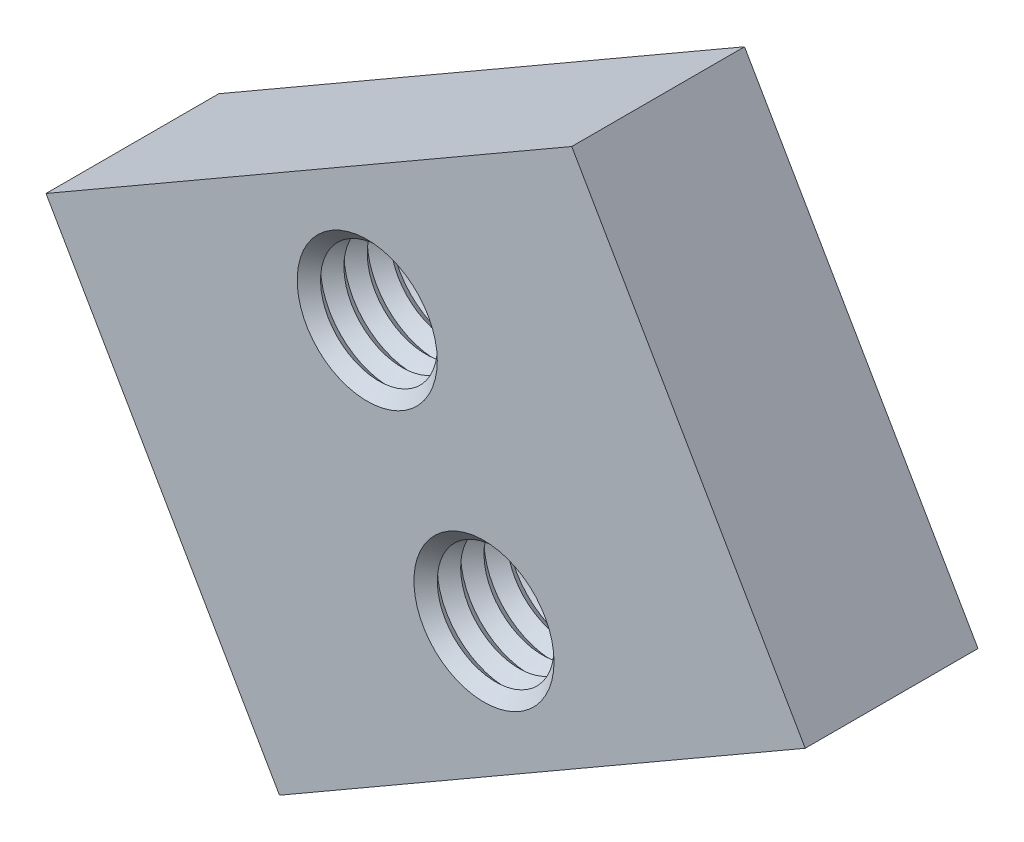
ISO-10303-21;
HEADER;
FILE_DESCRIPTION(('STEP AP214'),'2;1');
FILE_NAME('part.step','',(''),(''),'','','');
FILE_SCHEMA(('AUTOMOTIVE_DESIGN { 1 0 10303 214 1 1 1 1 }'));
ENDSEC;
DATA;
#1=APPLICATION_CONTEXT('core data for automotive mechanical design processes');
#2=APPLICATION_PROTOCOL_DEFINITION('international standard','automotive_design',2000,#1);
#3=PRODUCT_CONTEXT('',#1,'mechanical');
#4=PRODUCT('Part','Part','',(#3));
#5=PRODUCT_RELATED_PRODUCT_CATEGORY('part','',(#4));
#6=PRODUCT_DEFINITION_FORMATION('','',#4);
#7=PRODUCT_DEFINITION_CONTEXT('part definition',#1,'design');
#8=PRODUCT_DEFINITION('design','',#6,#7);
#9=PRODUCT_DEFINITION_SHAPE('','',#8);
#10=(LENGTH_UNIT() NAMED_UNIT(*) SI_UNIT(.MILLI.,.METRE.));
#11=(NAMED_UNIT(*) PLANE_ANGLE_UNIT() SI_UNIT($,.RADIAN.));
#12=(NAMED_UNIT(*) SI_UNIT($,.STERADIAN.) SOLID_ANGLE_UNIT());
#13=UNCERTAINTY_MEASURE_WITH_UNIT(LENGTH_MEASURE(1.E-05),#10,'distance_accuracy_value','');
#14=(GEOMETRIC_REPRESENTATION_CONTEXT(3) GLOBAL_UNCERTAINTY_ASSIGNED_CONTEXT((#13)) GLOBAL_UNIT_ASSIGNED_CONTEXT((#10,
#11,#12)) REPRESENTATION_CONTEXT('',''));
#15=CARTESIAN_POINT('',(0.,0.,0.));
#16=DIRECTION('',(0.,0.,1.));
#17=DIRECTION('',(1.,0.,0.));
#18=AXIS2_PLACEMENT_3D('',#15,#16,#17);
#19=CARTESIAN_POINT('',(29.,-50.2294734194975,47.1999999999753));
#20=DIRECTION('',(0.,0.,1.));
#21=DIRECTION('',(0.,-1.,0.));
#22=AXIS2_PLACEMENT_3D('',#19,#20,#21);
#23=CONICAL_SURFACE('',#22,1.500000000006,0.785398163441604);
#24=CARTESIAN_POINT('',(29.,-50.2294734194975,47.1999999999753));
#25=DIRECTION('',(0.,0.,-1.));
#26=DIRECTION('',(-0.866025403789103,-0.499999999991921,0.));
#27=AXIS2_PLACEMENT_3D('',#24,#25,#26);
#28=CIRCLE('',#27,1.500000000006);
#29=CARTESIAN_POINT('',(27.7009618943111,-50.9794734194884,47.1999999999753));
#30=VERTEX_POINT('',#29);
#31=EDGE_CURVE('E208',#30,#30,#28,.F.);
#32=ORIENTED_EDGE('',*,*,#31,.T.);
#33=EDGE_LOOP('',(#32));
#34=FACE_BOUND('',#33,.T.);
#35=CARTESIAN_POINT('',(29.,-50.2294734194975,46.9499999999812));
#36=DIRECTION('',(0.,0.,-1.));
#37=DIRECTION('',(-0.866025403784937,-0.499999999999137,0.));
#38=AXIS2_PLACEMENT_3D('',#35,#36,#37);
#39=CIRCLE('',#38,1.24999999998984);
#40=CARTESIAN_POINT('',(27.9174682452776,-50.8544734194913,46.9499999999812));
#41=VERTEX_POINT('',#40);
#42=EDGE_CURVE('E218',#41,#41,#39,.T.);
#43=ORIENTED_EDGE('',*,*,#42,.T.);
#44=EDGE_LOOP('',(#43));
#45=FACE_BOUND('',#44,.T.);
#46=ADVANCED_FACE('F17',(#34,#45),#23,.F.);
#47=CARTESIAN_POINT('',(31.5,-54.5596004384197,47.1999999999753));
#48=DIRECTION('',(0.,0.,1.));
#49=DIRECTION('',(0.,-1.,0.));
#50=AXIS2_PLACEMENT_3D('',#47,#48,#49);
#51=CONICAL_SURFACE('',#50,1.50000000001275,0.785398163441604);
#52=CARTESIAN_POINT('',(31.5,-54.5596004384197,47.1999999999753));
#53=DIRECTION('',(0.,0.,-1.));
#54=DIRECTION('',(-0.866025403786721,-0.499999999996046,0.));
#55=AXIS2_PLACEMENT_3D('',#52,#53,#54);
#56=CIRCLE('',#55,1.50000000001275);
#57=CARTESIAN_POINT('',(30.2009618943089,-55.3096004384201,47.1999999999753));
#58=VERTEX_POINT('',#57);
#59=EDGE_CURVE('E203',#58,#58,#56,.F.);
#60=ORIENTED_EDGE('',*,*,#59,.T.);
#61=EDGE_LOOP('',(#60));
#62=FACE_BOUND('',#61,.T.);
#63=CARTESIAN_POINT('',(31.5,-54.5596004384197,46.9499999999812));
#64=DIRECTION('',(0.,0.,-1.));
#65=DIRECTION('',(-0.866025403782079,-0.500000000004087,0.));
#66=AXIS2_PLACEMENT_3D('',#63,#64,#65);
#67=CIRCLE('',#66,1.24999999999658);
#68=CARTESIAN_POINT('',(30.4174682452754,-55.1846004384231,46.9499999999812));
#69=VERTEX_POINT('',#68);
#70=EDGE_CURVE('E213',#69,#69,#67,.T.);
#71=ORIENTED_EDGE('',*,*,#70,.T.);
#72=EDGE_LOOP('',(#71));
#73=FACE_BOUND('',#72,.T.);
#74=ADVANCED_FACE('F385',(#62,#73),#51,.F.);
#75=CARTESIAN_POINT('',(29.,-50.2294734194975,46.6999999999302));
#76=DIRECTION('',(0.,0.,-1.));
#77=DIRECTION('',(-1.,0.,0.));
#78=AXIS2_PLACEMENT_3D('',#75,#76,#77);
#79=CONICAL_SURFACE('',#78,1.50000000002021,0.785398163369529);
#80=CARTESIAN_POINT('',(29.,-50.2294734194975,46.7000000000439));
#81=DIRECTION('',(0.,0.,1.));
#82=DIRECTION('',(-0.866025403780898,-0.500000000006132,0.));
#83=AXIS2_PLACEMENT_3D('',#80,#81,#82);
#84=CIRCLE('',#83,1.50000000002021);
#85=CARTESIAN_POINT('',(27.7009618943111,-50.9794734195168,46.7000000000439));
#86=VERTEX_POINT('',#85);
#87=EDGE_CURVE('E198',#86,#86,#84,.F.);
#88=ORIENTED_EDGE('',*,*,#87,.T.);
#89=EDGE_LOOP('',(#88));
#90=FACE_BOUND('',#89,.T.);
#91=ORIENTED_EDGE('',*,*,#42,.F.);
#92=EDGE_LOOP('',(#91));
#93=FACE_BOUND('',#92,.T.);
#94=ADVANCED_FACE('F382',(#90,#93),#79,.F.);
#95=CARTESIAN_POINT('',(31.5,-54.5596004384197,46.7000000000439));
#96=DIRECTION('',(0.,0.,-1.));
#97=DIRECTION('',(-1.,0.,0.));
#98=AXIS2_PLACEMENT_3D('',#95,#96,#97);
#99=CONICAL_SURFACE('',#98,1.49999999994931,0.785398163441605);
#100=CARTESIAN_POINT('',(31.5,-54.5596004384197,46.7000000000439));
#101=DIRECTION('',(0.,0.,1.));
#102=DIRECTION('',(-0.866025403778517,-0.500000000010257,0.));
#103=AXIS2_PLACEMENT_3D('',#100,#101,#102);
#104=CIRCLE('',#103,1.50000000002696);
#105=CARTESIAN_POINT('',(30.2009618943089,-55.3096004384486,46.7000000000439));
#106=VERTEX_POINT('',#105);
#107=EDGE_CURVE('E193',#106,#106,#104,.F.);
#108=ORIENTED_EDGE('',*,*,#107,.T.);
#109=EDGE_LOOP('',(#108));
#110=FACE_BOUND('',#109,.T.);
#111=ORIENTED_EDGE('',*,*,#70,.F.);
#112=EDGE_LOOP('',(#111));
#113=FACE_BOUND('',#112,.T.);
#114=ADVANCED_FACE('F378',(#110,#113),#99,.F.);
#115=CARTESIAN_POINT('',(29.,-50.2294734194975,47.2000000000321));
#116=DIRECTION('',(0.,0.,-1.));
#117=DIRECTION('',(-1.,0.,0.));
#118=AXIS2_PLACEMENT_3D('',#115,#116,#117);
#119=CONICAL_SURFACE('',#118,1.49999999989334,0.785398163343147);
#120=ORIENTED_EDGE('',*,*,#31,.F.);
#121=EDGE_LOOP('',(#120));
#122=FACE_BOUND('',#121,.T.);
#123=CARTESIAN_POINT('',(29.,-50.2294734194975,47.4500000000262));
#124=DIRECTION('',(0.,0.,1.));
#125=DIRECTION('',(-0.866025403784937,-0.499999999999137,0.));
#126=AXIS2_PLACEMENT_3D('',#123,#124,#125);
#127=CIRCLE('',#126,1.24999999998984);
#128=CARTESIAN_POINT('',(27.9174682452776,-50.8544734194913,47.4500000000262));
#129=VERTEX_POINT('',#128);
#130=EDGE_CURVE('E188',#129,#129,#127,.T.);
#131=ORIENTED_EDGE('',*,*,#130,.T.);
#132=EDGE_LOOP('',(#131));
#133=FACE_BOUND('',#132,.T.);
#134=ADVANCED_FACE('F374',(#122,#133),#119,.F.);
#135=CARTESIAN_POINT('',(31.5,-54.5596004384197,47.2000000000321));
#136=DIRECTION('',(0.,0.,-1.));
#137=DIRECTION('',(-1.,0.,0.));
#138=AXIS2_PLACEMENT_3D('',#135,#136,#137);
#139=CONICAL_SURFACE('',#138,1.49999999990008,0.785398163343149);
#140=ORIENTED_EDGE('',*,*,#59,.F.);
#141=EDGE_LOOP('',(#140));
#142=FACE_BOUND('',#141,.T.);
#143=CARTESIAN_POINT('',(31.5,-54.5596004384197,47.4500000000262));
#144=DIRECTION('',(0.,0.,1.));
#145=DIRECTION('',(-0.866025403782079,-0.500000000004087,0.));
#146=AXIS2_PLACEMENT_3D('',#143,#144,#145);
#147=CIRCLE('',#146,1.24999999999658);
#148=CARTESIAN_POINT('',(30.4174682452754,-55.1846004384231,47.4500000000262));
#149=VERTEX_POINT('',#148);
#150=EDGE_CURVE('E183',#149,#149,#147,.T.);
#151=ORIENTED_EDGE('',*,*,#150,.T.);
#152=EDGE_LOOP('',(#151));
#153=FACE_BOUND('',#152,.T.);
#154=ADVANCED_FACE('F370',(#142,#153),#139,.F.);
#155=CARTESIAN_POINT('',(29.,-50.2294734194975,46.7000000000439));
#156=DIRECTION('',(0.,0.,1.));
#157=DIRECTION('',(1.,0.,0.));
#158=AXIS2_PLACEMENT_3D('',#155,#156,#157);
#159=CONICAL_SURFACE('',#158,1.50000000002021,0.785398163369529);
#160=ORIENTED_EDGE('',*,*,#87,.F.);
#161=EDGE_LOOP('',(#160));
#162=FACE_BOUND('',#161,.T.);
#163=CARTESIAN_POINT('',(29.,-50.2294734194975,46.4499999999362));
#164=DIRECTION('',(0.,0.,-1.));
#165=DIRECTION('',(-0.86602540378646,-0.499999999996499,0.));
#166=AXIS2_PLACEMENT_3D('',#163,#164,#165);
#167=CIRCLE('',#166,1.25000000005327);
#168=CARTESIAN_POINT('',(27.9174682452208,-50.8544734195198,46.4499999999362));
#169=VERTEX_POINT('',#168);
#170=EDGE_CURVE('E178',#169,#169,#167,.T.);
#171=ORIENTED_EDGE('',*,*,#170,.T.);
#172=EDGE_LOOP('',(#171));
#173=FACE_BOUND('',#172,.T.);
#174=ADVANCED_FACE('F366',(#162,#173),#159,.F.);
#175=CARTESIAN_POINT('',(31.5,-54.5596004384197,46.7000000000439));
#176=DIRECTION('',(0.,0.,1.));
#177=DIRECTION('',(1.,0.,0.));
#178=AXIS2_PLACEMENT_3D('',#175,#176,#177);
#179=CONICAL_SURFACE('',#178,1.50000000002696,0.78539816336953);
#180=ORIENTED_EDGE('',*,*,#107,.F.);
#181=EDGE_LOOP('',(#180));
#182=FACE_BOUND('',#181,.T.);
#183=CARTESIAN_POINT('',(31.5,-54.5596004384197,46.4500000000498));
#184=DIRECTION('',(0.,0.,-1.));
#185=DIRECTION('',(-0.866025403780556,-0.500000000006725,0.));
#186=AXIS2_PLACEMENT_3D('',#183,#184,#185);
#187=CIRCLE('',#186,1.24999999993315);
#188=CARTESIAN_POINT('',(30.4174682453322,-55.1846004383947,46.4500000000498));
#189=VERTEX_POINT('',#188);
#190=EDGE_CURVE('E173',#189,#189,#187,.T.);
#191=ORIENTED_EDGE('',*,*,#190,.T.);
#192=EDGE_LOOP('',(#191));
#193=FACE_BOUND('',#192,.T.);
#194=ADVANCED_FACE('F362',(#182,#193),#179,.F.);
#195=CARTESIAN_POINT('',(29.,-50.2294734194975,47.6999999999634));
#196=DIRECTION('',(0.,0.,1.));
#197=DIRECTION('',(1.,0.,0.));
#198=AXIS2_PLACEMENT_3D('',#195,#196,#197);
#199=CONICAL_SURFACE('',#198,1.49999999989334,0.785398163329957);
#200=CARTESIAN_POINT('',(29.,-50.2294734194975,47.7000000000203));
#201=DIRECTION('',(0.,0.,-1.));
#202=DIRECTION('',(-0.866025403779629,-0.50000000000833,0.));
#203=AXIS2_PLACEMENT_3D('',#200,#201,#202);
#204=CIRCLE('',#203,1.49999999995677);
#205=CARTESIAN_POINT('',(27.700961894368,-50.9794734194884,47.7000000000203));
#206=VERTEX_POINT('',#205);
#207=EDGE_CURVE('E168',#206,#206,#204,.F.);
#208=ORIENTED_EDGE('',*,*,#207,.T.);
#209=EDGE_LOOP('',(#208));
#210=FACE_BOUND('',#209,.T.);
#211=ORIENTED_EDGE('',*,*,#130,.F.);
#212=EDGE_LOOP('',(#211));
#213=FACE_BOUND('',#212,.T.);
#214=ADVANCED_FACE('F358',(#210,#213),#199,.F.);
#215=CARTESIAN_POINT('',(31.5,-54.5596004384197,47.6999999999634));
#216=DIRECTION('',(0.,0.,1.));
#217=DIRECTION('',(1.,0.,0.));
#218=AXIS2_PLACEMENT_3D('',#215,#216,#217);
#219=CONICAL_SURFACE('',#218,1.49999999990008,0.785398163329957);
#220=CARTESIAN_POINT('',(31.5,-54.5596004384197,47.7000000000203));
#221=DIRECTION('',(0.,0.,-1.));
#222=DIRECTION('',(-0.866025403777248,-0.500000000012455,0.));
#223=AXIS2_PLACEMENT_3D('',#220,#221,#222);
#224=CIRCLE('',#223,1.49999999996352);
#225=CARTESIAN_POINT('',(30.2009618943657,-55.3096004384201,47.7000000000203));
#226=VERTEX_POINT('',#225);
#227=EDGE_CURVE('E163',#226,#226,#224,.F.);
#228=ORIENTED_EDGE('',*,*,#227,.T.);
#229=EDGE_LOOP('',(#228));
#230=FACE_BOUND('',#229,.T.);
#231=ORIENTED_EDGE('',*,*,#150,.F.);
#232=EDGE_LOOP('',(#231));
#233=FACE_BOUND('',#232,.T.);
#234=ADVANCED_FACE('F354',(#230,#233),#219,.F.);
#235=CARTESIAN_POINT('',(29.,-50.2294734194975,46.2000000000558));
#236=DIRECTION('',(0.,0.,-1.));
#237=DIRECTION('',(-1.,0.,0.));
#238=AXIS2_PLACEMENT_3D('',#235,#236,#237);
#239=CONICAL_SURFACE('',#238,1.49999999994256,0.785398163415223);
#240=CARTESIAN_POINT('',(29.,-50.2294734194975,46.1999999999989));
#241=DIRECTION('',(0.,0.,1.));
#242=DIRECTION('',(-0.866025403779629,-0.50000000000833,0.));
#243=AXIS2_PLACEMENT_3D('',#240,#241,#242);
#244=CIRCLE('',#243,1.49999999995677);
#245=CARTESIAN_POINT('',(27.700961894368,-50.9794734194884,46.1999999999989));
#246=VERTEX_POINT('',#245);
#247=EDGE_CURVE('E158',#246,#246,#244,.F.);
#248=ORIENTED_EDGE('',*,*,#247,.T.);
#249=EDGE_LOOP('',(#248));
#250=FACE_BOUND('',#249,.T.);
#251=ORIENTED_EDGE('',*,*,#170,.F.);
#252=EDGE_LOOP('',(#251));
#253=FACE_BOUND('',#252,.T.);
#254=ADVANCED_FACE('F350',(#250,#253),#239,.F.);
#255=CARTESIAN_POINT('',(31.5,-54.5596004384197,46.2000000000558));
#256=DIRECTION('',(0.,0.,-1.));
#257=DIRECTION('',(-1.,0.,0.));
#258=AXIS2_PLACEMENT_3D('',#255,#256,#257);
#259=CONICAL_SURFACE('',#258,1.49999999994931,0.785398163441605);
#260=CARTESIAN_POINT('',(31.5,-54.5596004384197,46.1999999999989));
#261=DIRECTION('',(0.,0.,1.));
#262=DIRECTION('',(-0.866025403777248,-0.500000000012455,0.));
#263=AXIS2_PLACEMENT_3D('',#260,#261,#262);
#264=CIRCLE('',#263,1.49999999996352);
#265=CARTESIAN_POINT('',(30.2009618943657,-55.3096004384201,46.1999999999989));
#266=VERTEX_POINT('',#265);
#267=EDGE_CURVE('E153',#266,#266,#264,.F.);
#268=ORIENTED_EDGE('',*,*,#267,.T.);
#269=EDGE_LOOP('',(#268));
#270=FACE_BOUND('',#269,.T.);
#271=ORIENTED_EDGE('',*,*,#190,.F.);
#272=EDGE_LOOP('',(#271));
#273=FACE_BOUND('',#272,.T.);
#274=ADVANCED_FACE('F346',(#270,#273),#259,.F.);
#275=CARTESIAN_POINT('',(29.,-50.2294734194975,47.7000000000203));
#276=DIRECTION('',(0.,0.,-1.));
#277=DIRECTION('',(-1.,0.,0.));
#278=AXIS2_PLACEMENT_3D('',#275,#276,#277);
#279=CONICAL_SURFACE('',#278,1.49999999995677,0.785398163356339);
#280=ORIENTED_EDGE('',*,*,#207,.F.);
#281=EDGE_LOOP('',(#280));
#282=FACE_BOUND('',#281,.T.);
#283=CARTESIAN_POINT('',(29.,-50.2294734194975,47.9499999999575));
#284=DIRECTION('',(0.,0.,1.));
#285=DIRECTION('',(-0.866025403794783,-0.499999999982084,0.));
#286=AXIS2_PLACEMENT_3D('',#283,#284,#285);
#287=CIRCLE('',#286,1.24999999997562);
#288=CARTESIAN_POINT('',(27.9174682452776,-50.8544734194629,47.9499999999575));
#289=VERTEX_POINT('',#288);
#290=EDGE_CURVE('E148',#289,#289,#287,.T.);
#291=ORIENTED_EDGE('',*,*,#290,.T.);
#292=EDGE_LOOP('',(#291));
#293=FACE_BOUND('',#292,.T.);
#294=ADVANCED_FACE('F338',(#282,#293),#279,.F.);
#295=CARTESIAN_POINT('',(31.5,-54.5596004384197,47.7000000000203));
#296=DIRECTION('',(0.,0.,-1.));
#297=DIRECTION('',(-1.,0.,0.));
#298=AXIS2_PLACEMENT_3D('',#295,#296,#297);
#299=CONICAL_SURFACE('',#298,1.49999999996352,0.785398163356339);
#300=ORIENTED_EDGE('',*,*,#227,.F.);
#301=EDGE_LOOP('',(#300));
#302=FACE_BOUND('',#301,.T.);
#303=CARTESIAN_POINT('',(31.5,-54.5596004384197,47.9499999999575));
#304=DIRECTION('',(0.,0.,1.));
#305=DIRECTION('',(-0.866025403791925,-0.499999999987034,0.));
#306=AXIS2_PLACEMENT_3D('',#303,#304,#305);
#307=CIRCLE('',#306,1.24999999998237);
#308=CARTESIAN_POINT('',(30.4174682452754,-55.1846004383947,47.9499999999575));
#309=VERTEX_POINT('',#308);
#310=EDGE_CURVE('E143',#309,#309,#307,.T.);
#311=ORIENTED_EDGE('',*,*,#310,.T.);
#312=EDGE_LOOP('',(#311));
#313=FACE_BOUND('',#312,.T.);
#314=ADVANCED_FACE('F327',(#302,#313),#299,.F.);
#315=CARTESIAN_POINT('',(29.,-50.2294734194975,46.1999999999989));
#316=DIRECTION('',(0.,0.,1.));
#317=DIRECTION('',(1.,0.,0.));
#318=AXIS2_PLACEMENT_3D('',#315,#316,#317);
#319=CONICAL_SURFACE('',#318,1.49999999995677,0.785398163329958);
#320=ORIENTED_EDGE('',*,*,#247,.F.);
#321=EDGE_LOOP('',(#320));
#322=FACE_BOUND('',#321,.T.);
#323=CARTESIAN_POINT('',(29.,-50.2294734194975,45.949999999948));
#324=DIRECTION('',(0.,0.,-1.));
#325=DIRECTION('',(-0.866025403775092,-0.50000000001619,0.));
#326=AXIS2_PLACEMENT_3D('',#323,#324,#325);
#327=CIRCLE('',#326,1.25000000000405);
#328=CARTESIAN_POINT('',(27.9174682452776,-50.8544734195198,45.949999999948));
#329=VERTEX_POINT('',#328);
#330=EDGE_CURVE('E138',#329,#329,#327,.T.);
#331=ORIENTED_EDGE('',*,*,#330,.T.);
#332=EDGE_LOOP('',(#331));
#333=FACE_BOUND('',#332,.T.);
#334=ADVANCED_FACE('F324',(#322,#333),#319,.F.);
#335=CARTESIAN_POINT('',(31.5,-54.5596004384197,46.1999999999989));
#336=DIRECTION('',(0.,0.,1.));
#337=DIRECTION('',(1.,0.,0.));
#338=AXIS2_PLACEMENT_3D('',#335,#336,#337);
#339=CONICAL_SURFACE('',#338,1.49999999996352,0.785398163329958);
#340=ORIENTED_EDGE('',*,*,#267,.F.);
#341=EDGE_LOOP('',(#340));
#342=FACE_BOUND('',#341,.T.);
#343=CARTESIAN_POINT('',(31.5,-54.5596004384197,45.949999999948));
#344=DIRECTION('',(0.,0.,-1.));
#345=DIRECTION('',(-0.866025403772234,-0.50000000002114,0.));
#346=AXIS2_PLACEMENT_3D('',#343,#344,#345);
#347=CIRCLE('',#346,1.2500000000108);
#348=CARTESIAN_POINT('',(30.4174682452754,-55.1846004384515,45.949999999948));
#349=VERTEX_POINT('',#348);
#350=EDGE_CURVE('E133',#349,#349,#347,.T.);
#351=ORIENTED_EDGE('',*,*,#350,.T.);
#352=EDGE_LOOP('',(#351));
#353=FACE_BOUND('',#352,.T.);
#354=ADVANCED_FACE('F326',(#342,#353),#339,.F.);
#355=CARTESIAN_POINT('',(29.,-50.2294734194975,48.1999999998379));
#356=DIRECTION('',(0.,0.,1.));
#357=DIRECTION('',(0.,-1.,0.));
#358=AXIS2_PLACEMENT_3D('',#355,#356,#357);
#359=CONICAL_SURFACE('',#358,1.49999999981569,0.785398163316767);
#360=CARTESIAN_POINT('',(29.,-50.2294734194975,48.1999999999516));
#361=DIRECTION('',(0.,0.,-1.));
#362=DIRECTION('',(-0.866025403780898,-0.500000000006132,0.));
#363=AXIS2_PLACEMENT_3D('',#360,#361,#362);
#364=CIRCLE('',#363,1.50000000002021);
#365=CARTESIAN_POINT('',(27.7009618943111,-50.9794734195168,48.1999999999516));
#366=VERTEX_POINT('',#365);
#367=EDGE_CURVE('E128',#366,#366,#364,.F.);
#368=ORIENTED_EDGE('',*,*,#367,.T.);
#369=EDGE_LOOP('',(#368));
#370=FACE_BOUND('',#369,.T.);
#371=ORIENTED_EDGE('',*,*,#290,.F.);
#372=EDGE_LOOP('',(#371));
#373=FACE_BOUND('',#372,.T.);
#374=ADVANCED_FACE('F335',(#370,#373),#359,.F.);
#375=CARTESIAN_POINT('',(31.5,-54.5596004384197,48.1999999998379));
#376=DIRECTION('',(0.,0.,1.));
#377=DIRECTION('',(0.,-1.,0.));
#378=AXIS2_PLACEMENT_3D('',#375,#376,#377);
#379=CONICAL_SURFACE('',#378,1.49999999982243,0.785398163316767);
#380=CARTESIAN_POINT('',(31.5,-54.5596004384197,48.1999999999516));
#381=DIRECTION('',(0.,0.,-1.));
#382=DIRECTION('',(-0.866025403778517,-0.500000000010257,0.));
#383=AXIS2_PLACEMENT_3D('',#380,#381,#382);
#384=CIRCLE('',#383,1.50000000002696);
#385=CARTESIAN_POINT('',(30.2009618943089,-55.3096004384486,48.1999999999516));
#386=VERTEX_POINT('',#385);
#387=EDGE_CURVE('E123',#386,#386,#384,.F.);
#388=ORIENTED_EDGE('',*,*,#387,.T.);
#389=EDGE_LOOP('',(#388));
#390=FACE_BOUND('',#389,.T.);
#391=ORIENTED_EDGE('',*,*,#310,.F.);
#392=EDGE_LOOP('',(#391));
#393=FACE_BOUND('',#392,.T.);
#394=ADVANCED_FACE('F320',(#390,#393),#379,.F.);
#395=CARTESIAN_POINT('',(29.,-50.2294734194975,45.6999999999539));
#396=DIRECTION('',(0.,0.,-1.));
#397=DIRECTION('',(-1.,0.,0.));
#398=AXIS2_PLACEMENT_3D('',#395,#396,#397);
#399=CONICAL_SURFACE('',#398,1.49999999997098,0.785398163343149);
#400=CARTESIAN_POINT('',(29.,-50.2294734194975,45.7000000000107));
#401=DIRECTION('',(0.,0.,1.));
#402=DIRECTION('',(-0.866025403779629,-0.50000000000833,0.));
#403=AXIS2_PLACEMENT_3D('',#400,#401,#402);
#404=CIRCLE('',#403,1.49999999995677);
#405=CARTESIAN_POINT('',(27.700961894368,-50.9794734194884,45.7000000000107));
#406=VERTEX_POINT('',#405);
#407=EDGE_CURVE('E118',#406,#406,#404,.F.);
#408=ORIENTED_EDGE('',*,*,#407,.T.);
#409=EDGE_LOOP('',(#408));
#410=FACE_BOUND('',#409,.T.);
#411=ORIENTED_EDGE('',*,*,#330,.F.);
#412=EDGE_LOOP('',(#411));
#413=FACE_BOUND('',#412,.T.);
#414=ADVANCED_FACE('F260',(#410,#413),#399,.F.);
#415=CARTESIAN_POINT('',(31.5,-54.5596004384197,45.6999999999539));
#416=DIRECTION('',(0.,0.,-1.));
#417=DIRECTION('',(-1.,0.,0.));
#418=AXIS2_PLACEMENT_3D('',#415,#416,#417);
#419=CONICAL_SURFACE('',#418,1.49999999997773,0.785398163343147);
#420=CARTESIAN_POINT('',(31.5,-54.5596004384197,45.7000000000107));
#421=DIRECTION('',(0.,0.,1.));
#422=DIRECTION('',(-0.866025403777248,-0.500000000012455,0.));
#423=AXIS2_PLACEMENT_3D('',#420,#421,#422);
#424=CIRCLE('',#423,1.49999999996352);
#425=CARTESIAN_POINT('',(30.2009618943657,-55.3096004384201,45.7000000000107));
#426=VERTEX_POINT('',#425);
#427=EDGE_CURVE('E113',#426,#426,#424,.F.);
#428=ORIENTED_EDGE('',*,*,#427,.T.);
#429=EDGE_LOOP('',(#428));
#430=FACE_BOUND('',#429,.T.);
#431=ORIENTED_EDGE('',*,*,#350,.F.);
#432=EDGE_LOOP('',(#431));
#433=FACE_BOUND('',#432,.T.);
#434=ADVANCED_FACE('F248',(#430,#433),#419,.F.);
#435=CARTESIAN_POINT('',(29.,-50.2294734194975,48.1999999999516));
#436=DIRECTION('',(0.,0.,-1.));
#437=DIRECTION('',(-1.,0.,0.));
#438=AXIS2_PLACEMENT_3D('',#435,#436,#437);
#439=CONICAL_SURFACE('',#438,1.50000000002021,0.785398163441604);
#440=ORIENTED_EDGE('',*,*,#367,.F.);
#441=EDGE_LOOP('',(#440));
#442=FACE_BOUND('',#441,.T.);
#443=CARTESIAN_POINT('',(29.,-50.2294734194975,48.4499999999457));
#444=DIRECTION('',(0.,0.,1.));
#445=DIRECTION('',(-0.866025403794783,-0.499999999982084,0.));
#446=AXIS2_PLACEMENT_3D('',#443,#444,#445);
#447=CIRCLE('',#446,1.24999999997562);
#448=CARTESIAN_POINT('',(27.9174682452776,-50.8544734194629,48.4499999999457));
#449=VERTEX_POINT('',#448);
#450=EDGE_CURVE('E108',#449,#449,#447,.T.);
#451=ORIENTED_EDGE('',*,*,#450,.T.);
#452=EDGE_LOOP('',(#451));
#453=FACE_BOUND('',#452,.T.);
#454=ADVANCED_FACE('F245',(#442,#453),#439,.F.);
#455=CARTESIAN_POINT('',(31.5,-54.5596004384197,48.1999999999516));
#456=DIRECTION('',(0.,0.,-1.));
#457=DIRECTION('',(-1.,0.,0.));
#458=AXIS2_PLACEMENT_3D('',#455,#456,#457);
#459=CONICAL_SURFACE('',#458,1.50000000002696,0.785398163441604);
#460=ORIENTED_EDGE('',*,*,#387,.F.);
#461=EDGE_LOOP('',(#460));
#462=FACE_BOUND('',#461,.T.);
#463=CARTESIAN_POINT('',(31.5,-54.5596004384197,48.4499999999457));
#464=DIRECTION('',(0.,0.,1.));
#465=DIRECTION('',(-0.866025403791925,-0.499999999987034,0.));
#466=AXIS2_PLACEMENT_3D('',#463,#464,#465);
#467=CIRCLE('',#466,1.24999999998237);
#468=CARTESIAN_POINT('',(30.4174682452754,-55.1846004383947,48.4499999999457));
#469=VERTEX_POINT('',#468);
#470=EDGE_CURVE('E103',#469,#469,#467,.T.);
#471=ORIENTED_EDGE('',*,*,#470,.T.);
#472=EDGE_LOOP('',(#471));
#473=FACE_BOUND('',#472,.T.);
#474=ADVANCED_FACE('F247',(#462,#473),#459,.F.);
#475=CARTESIAN_POINT('',(29.,-50.2294734194975,45.7000000000107));
#476=DIRECTION('',(0.,0.,1.));
#477=DIRECTION('',(1.,0.,0.));
#478=AXIS2_PLACEMENT_3D('',#475,#476,#477);
#479=CONICAL_SURFACE('',#478,1.49999999995677,0.785398163441604);
#480=ORIENTED_EDGE('',*,*,#407,.F.);
#481=EDGE_LOOP('',(#480));
#482=FACE_BOUND('',#481,.T.);
#483=CARTESIAN_POINT('',(29.,-50.2294734194975,45.4500000000166));
#484=DIRECTION('',(0.,0.,-1.));
#485=DIRECTION('',(-0.866025403784937,-0.499999999999137,0.));
#486=AXIS2_PLACEMENT_3D('',#483,#484,#485);
#487=CIRCLE('',#486,1.24999999998984);
#488=CARTESIAN_POINT('',(27.9174682452776,-50.8544734194913,45.4500000000166));
#489=VERTEX_POINT('',#488);
#490=EDGE_CURVE('E98',#489,#489,#487,.T.);
#491=ORIENTED_EDGE('',*,*,#490,.T.);
#492=EDGE_LOOP('',(#491));
#493=FACE_BOUND('',#492,.T.);
#494=ADVANCED_FACE('F257',(#482,#493),#479,.F.);
#495=CARTESIAN_POINT('',(31.5,-54.5596004384197,45.7000000000107));
#496=DIRECTION('',(0.,0.,1.));
#497=DIRECTION('',(1.,0.,0.));
#498=AXIS2_PLACEMENT_3D('',#495,#496,#497);
#499=CONICAL_SURFACE('',#498,1.49999999996352,0.785398163441605);
#500=ORIENTED_EDGE('',*,*,#427,.F.);
#501=EDGE_LOOP('',(#500));
#502=FACE_BOUND('',#501,.T.);
#503=CARTESIAN_POINT('',(31.5,-54.5596004384197,45.4500000000166));
#504=DIRECTION('',(0.,0.,-1.));
#505=DIRECTION('',(-0.866025403782079,-0.500000000004087,0.));
#506=AXIS2_PLACEMENT_3D('',#503,#504,#505);
#507=CIRCLE('',#506,1.24999999999658);
#508=CARTESIAN_POINT('',(30.4174682452754,-55.1846004384231,45.4500000000166));
#509=VERTEX_POINT('',#508);
#510=EDGE_CURVE('E95',#509,#509,#507,.T.);
#511=ORIENTED_EDGE('',*,*,#510,.T.);
#512=EDGE_LOOP('',(#511));
#513=FACE_BOUND('',#512,.T.);
#514=ADVANCED_FACE('F241',(#502,#513),#499,.F.);
#515=CARTESIAN_POINT('',(29.,-50.2294734194975,48.6999999999966));
#516=DIRECTION('',(0.,0.,1.));
#517=DIRECTION('',(1.,0.,0.));
#518=AXIS2_PLACEMENT_3D('',#515,#516,#517);
#519=CONICAL_SURFACE('',#518,1.500000000006,0.785398163356339);
#520=CARTESIAN_POINT('',(29.,-50.2294734194975,48.6999999999966));
#521=DIRECTION('',(0.,0.,1.));
#522=DIRECTION('',(1.,0.,0.));
#523=AXIS2_PLACEMENT_3D('',#520,#521,#522);
#524=CIRCLE('',#523,1.500000000006);
#525=CARTESIAN_POINT('',(30.500000000006,-50.2294734194975,48.6999999999966));
#526=VERTEX_POINT('',#525);
#527=EDGE_CURVE('E20',#526,#526,#524,.F.);
#528=ORIENTED_EDGE('',*,*,#527,.F.);
#529=EDGE_LOOP('',(#528));
#530=FACE_BOUND('',#529,.T.);
#531=ORIENTED_EDGE('',*,*,#450,.F.);
#532=EDGE_LOOP('',(#531));
#533=FACE_BOUND('',#532,.T.);
#534=ADVANCED_FACE('F237',(#530,#533),#519,.F.);
#535=CARTESIAN_POINT('',(31.5,-54.5596004384197,48.6999999999966));
#536=DIRECTION('',(0.,0.,1.));
#537=DIRECTION('',(1.,0.,0.));
#538=AXIS2_PLACEMENT_3D('',#535,#536,#537);
#539=CONICAL_SURFACE('',#538,1.50000000001275,0.785398163356339);
#540=CARTESIAN_POINT('',(31.5,-54.5596004384197,48.6999999999966));
#541=DIRECTION('',(0.,0.,1.));
#542=DIRECTION('',(1.,0.,0.));
#543=AXIS2_PLACEMENT_3D('',#540,#541,#542);
#544=CIRCLE('',#543,1.50000000001275);
#545=CARTESIAN_POINT('',(33.0000000000127,-54.5596004384197,48.6999999999966));
#546=VERTEX_POINT('',#545);
#547=EDGE_CURVE('E92',#546,#546,#544,.F.);
#548=ORIENTED_EDGE('',*,*,#547,.F.);
#549=EDGE_LOOP('',(#548));
#550=FACE_BOUND('',#549,.T.);
#551=ORIENTED_EDGE('',*,*,#470,.F.);
#552=EDGE_LOOP('',(#551));
#553=FACE_BOUND('',#552,.T.);
#554=ADVANCED_FACE('F240',(#550,#553),#539,.F.);
#555=CARTESIAN_POINT('',(29.,-50.2294734194975,45.2000000000794));
#556=DIRECTION('',(0.,0.,-1.));
#557=DIRECTION('',(-1.,0.,0.));
#558=AXIS2_PLACEMENT_3D('',#555,#556,#557);
#559=CONICAL_SURFACE('',#558,1.49999999994256,0.785398163441604);
#560=CARTESIAN_POINT('',(29.,-50.2294734194975,45.2000000000226));
#561=DIRECTION('',(0.,0.,1.));
#562=DIRECTION('',(-0.866025403789103,-0.499999999991921,0.));
#563=AXIS2_PLACEMENT_3D('',#560,#561,#562);
#564=CIRCLE('',#563,1.500000000006);
#565=CARTESIAN_POINT('',(27.7009618943111,-50.9794734194884,45.2000000000226));
#566=VERTEX_POINT('',#565);
#567=EDGE_CURVE('E87',#566,#566,#564,.F.);
#568=ORIENTED_EDGE('',*,*,#567,.T.);
#569=EDGE_LOOP('',(#568));
#570=FACE_BOUND('',#569,.T.);
#571=ORIENTED_EDGE('',*,*,#490,.F.);
#572=EDGE_LOOP('',(#571));
#573=FACE_BOUND('',#572,.T.);
#574=ADVANCED_FACE('F297',(#570,#573),#559,.F.);
#575=CARTESIAN_POINT('',(31.5,-54.5596004384197,45.2000000000794));
#576=DIRECTION('',(0.,0.,-1.));
#577=DIRECTION('',(-1.,0.,0.));
#578=AXIS2_PLACEMENT_3D('',#575,#576,#577);
#579=CONICAL_SURFACE('',#578,1.49999999994931,0.785398163441605);
#580=CARTESIAN_POINT('',(31.5,-54.5596004384197,45.2000000000226));
#581=DIRECTION('',(0.,0.,1.));
#582=DIRECTION('',(-0.866025403786721,-0.499999999996046,0.));
#583=AXIS2_PLACEMENT_3D('',#580,#581,#582);
#584=CIRCLE('',#583,1.50000000001275);
#585=CARTESIAN_POINT('',(30.2009618943089,-55.3096004384201,45.2000000000226));
#586=VERTEX_POINT('',#585);
#587=EDGE_CURVE('E76',#586,#586,#584,.F.);
#588=ORIENTED_EDGE('',*,*,#587,.T.);
#589=EDGE_LOOP('',(#588));
#590=FACE_BOUND('',#589,.T.);
#591=ORIENTED_EDGE('',*,*,#510,.F.);
#592=EDGE_LOOP('',(#591));
#593=FACE_BOUND('',#592,.T.);
#594=ADVANCED_FACE('F294',(#590,#593),#579,.F.);
#595=CARTESIAN_POINT('',(27.120834875401,-59.9746639478808,48.7));
#596=DIRECTION('',(0.,0.,1.));
#597=DIRECTION('',(1.,0.,0.));
#598=AXIS2_PLACEMENT_3D('',#595,#596,#597);
#599=PLANE('',#598);
#600=DIRECTION('',(-0.5,0.866025403784439,0.));
#601=VECTOR('',#600,1.);
#602=CARTESIAN_POINT('',(33.3791651245987,-44.8144099100363,48.7));
#603=LINE('',#602,#601);
#604=CARTESIAN_POINT('',(33.3791651245987,-44.8144099100363,48.7));
#605=VERTEX_POINT('',#604);
#606=CARTESIAN_POINT('',(38.3791651245987,-53.4746639478808,48.7));
#607=VERTEX_POINT('',#606);
#608=EDGE_CURVE('E67',#605,#607,#603,.F.);
#609=ORIENTED_EDGE('',*,*,#608,.F.);
#610=DIRECTION('',(-0.866025403784439,-0.5,0.));
#611=VECTOR('',#610,1.);
#612=CARTESIAN_POINT('',(22.120834875401,-51.3144099100363,48.7));
#613=LINE('',#612,#611);
#614=CARTESIAN_POINT('',(22.120834875401,-51.3144099100363,48.7));
#615=VERTEX_POINT('',#614);
#616=EDGE_CURVE('E58',#615,#605,#613,.F.);
#617=ORIENTED_EDGE('',*,*,#616,.F.);
#618=DIRECTION('',(0.5,-0.866025403784439,0.));
#619=VECTOR('',#618,1.);
#620=CARTESIAN_POINT('',(27.120834875401,-59.9746639478808,48.7));
#621=LINE('',#620,#619);
#622=CARTESIAN_POINT('',(27.120834875401,-59.9746639478808,48.7));
#623=VERTEX_POINT('',#622);
#624=EDGE_CURVE('E53',#623,#615,#621,.F.);
#625=ORIENTED_EDGE('',*,*,#624,.F.);
#626=DIRECTION('',(0.866025403784439,0.5,0.));
#627=VECTOR('',#626,1.);
#628=CARTESIAN_POINT('',(38.3791651245987,-53.4746639478808,48.7));
#629=LINE('',#628,#627);
#630=EDGE_CURVE('E72',#607,#623,#629,.F.);
#631=ORIENTED_EDGE('',*,*,#630,.F.);
#632=EDGE_LOOP('',(#609,#617,#625,#631));
#633=FACE_BOUND('',#632,.T.);
#634=ORIENTED_EDGE('',*,*,#547,.T.);
#635=EDGE_LOOP('',(#634));
#636=FACE_BOUND('',#635,.T.);
#637=ORIENTED_EDGE('',*,*,#527,.T.);
#638=EDGE_LOOP('',(#637));
#639=FACE_BOUND('',#638,.T.);
#640=ADVANCED_FACE('F70',(#633,#636,#639),#599,.T.);
#641=CARTESIAN_POINT('',(29.,-50.2294734194975,45.2000000000226));
#642=DIRECTION('',(0.,0.,1.));
#643=DIRECTION('',(1.,0.,0.));
#644=AXIS2_PLACEMENT_3D('',#641,#642,#643);
#645=CONICAL_SURFACE('',#644,1.500000000006,0.785398163444902);
#646=ORIENTED_EDGE('',*,*,#567,.F.);
#647=EDGE_LOOP('',(#646));
#648=FACE_BOUND('',#647,.T.);
#649=CARTESIAN_POINT('',(29.,-50.2294734194975,45.0000000000159));
#650=DIRECTION('',(0.,0.,1.));
#651=DIRECTION('',(1.,0.,0.));
#652=AXIS2_PLACEMENT_3D('',#649,#650,#651);
#653=CIRCLE('',#652,1.29999999998038);
#654=CARTESIAN_POINT('',(30.2999999999804,-50.2294734194975,45.0000000000159));
#655=VERTEX_POINT('',#654);
#656=EDGE_CURVE('E228',#655,#655,#653,.F.);
#657=ORIENTED_EDGE('',*,*,#656,.T.);
#658=EDGE_LOOP('',(#657));
#659=FACE_BOUND('',#658,.T.);
#660=ADVANCED_FACE('F287',(#648,#659),#645,.F.);
#661=CARTESIAN_POINT('',(31.5,-54.5596004384197,45.2000000000226));
#662=DIRECTION('',(0.,0.,1.));
#663=DIRECTION('',(1.,0.,0.));
#664=AXIS2_PLACEMENT_3D('',#661,#662,#663);
#665=CONICAL_SURFACE('',#664,1.50000000001275,0.785398163444902);
#666=ORIENTED_EDGE('',*,*,#587,.F.);
#667=EDGE_LOOP('',(#666));
#668=FACE_BOUND('',#667,.T.);
#669=CARTESIAN_POINT('',(31.5,-54.5596004384197,45.0000000000159));
#670=DIRECTION('',(0.,0.,1.));
#671=DIRECTION('',(1.,0.,0.));
#672=AXIS2_PLACEMENT_3D('',#669,#670,#671);
#673=CIRCLE('',#672,1.29999999998713);
#674=CARTESIAN_POINT('',(32.7999999999871,-54.5596004384197,45.0000000000159));
#675=VERTEX_POINT('',#674);
#676=EDGE_CURVE('E225',#675,#675,#673,.F.);
#677=ORIENTED_EDGE('',*,*,#676,.T.);
#678=EDGE_LOOP('',(#677));
#679=FACE_BOUND('',#678,.T.);
#680=ADVANCED_FACE('F284',(#668,#679),#665,.F.);
#681=CARTESIAN_POINT('',(33.3791651245987,-44.8144099100363,45.));
#682=DIRECTION('',(0.866025403784439,0.5,0.));
#683=DIRECTION('',(-0.5,0.866025403784439,0.));
#684=AXIS2_PLACEMENT_3D('',#681,#682,#683);
#685=PLANE('',#684);
#686=DIRECTION('',(-0.5,0.866025403784442,0.));
#687=VECTOR('',#686,1.);
#688=CARTESIAN_POINT('',(38.3791651245987,-53.4746639478808,45.));
#689=LINE('',#688,#687);
#690=CARTESIAN_POINT('',(38.3791651245987,-53.4746639478808,45.));
#691=VERTEX_POINT('',#690);
#692=CARTESIAN_POINT('',(33.3791651245987,-44.8144099100363,45.));
#693=VERTEX_POINT('',#692);
#694=EDGE_CURVE('E80',#691,#693,#689,.T.);
#695=ORIENTED_EDGE('',*,*,#694,.T.);
#696=DIRECTION('',(0.,0.,1.));
#697=VECTOR('',#696,1.);
#698=CARTESIAN_POINT('',(33.3791651245987,-44.8144099100363,45.));
#699=LINE('',#698,#697);
#700=EDGE_CURVE('E63',#605,#693,#699,.F.);
#701=ORIENTED_EDGE('',*,*,#700,.F.);
#702=ORIENTED_EDGE('',*,*,#608,.T.);
#703=DIRECTION('',(0.,0.,1.));
#704=VECTOR('',#703,1.);
#705=CARTESIAN_POINT('',(38.3791651245987,-53.4746639478808,45.));
#706=LINE('',#705,#704);
#707=EDGE_CURVE('E230',#691,#607,#706,.T.);
#708=ORIENTED_EDGE('',*,*,#707,.F.);
#709=EDGE_LOOP('',(#695,#701,#702,#708));
#710=FACE_BOUND('',#709,.T.);
#711=ADVANCED_FACE('F79',(#710),#685,.T.);
#712=CARTESIAN_POINT('',(22.120834875401,-51.3144099100363,45.));
#713=DIRECTION('',(-0.5,0.866025403784439,0.));
#714=DIRECTION('',(-0.866025403784439,-0.5,0.));
#715=AXIS2_PLACEMENT_3D('',#712,#713,#714);
#716=PLANE('',#715);
#717=DIRECTION('',(-0.866025403784439,-0.5,0.));
#718=VECTOR('',#717,1.);
#719=CARTESIAN_POINT('',(33.3791651245987,-44.8144099100363,45.));
#720=LINE('',#719,#718);
#721=CARTESIAN_POINT('',(22.120834875401,-51.3144099100363,45.));
#722=VERTEX_POINT('',#721);
#723=EDGE_CURVE('E657',#693,#722,#720,.T.);
#724=ORIENTED_EDGE('',*,*,#723,.T.);
#725=DIRECTION('',(0.,0.,1.));
#726=VECTOR('',#725,1.);
#727=CARTESIAN_POINT('',(22.1208348754009,-51.3144099100363,45.));
#728=LINE('',#727,#726);
#729=EDGE_CURVE('E65',#615,#722,#728,.F.);
#730=ORIENTED_EDGE('',*,*,#729,.F.);
#731=ORIENTED_EDGE('',*,*,#616,.T.);
#732=ORIENTED_EDGE('',*,*,#700,.T.);
#733=EDGE_LOOP('',(#724,#730,#731,#732));
#734=FACE_BOUND('',#733,.T.);
#735=ADVANCED_FACE('F61',(#734),#716,.T.);
#736=CARTESIAN_POINT('',(27.120834875401,-59.9746639478808,45.));
#737=DIRECTION('',(-0.866025403784439,-0.5,0.));
#738=DIRECTION('',(0.5,-0.866025403784439,0.));
#739=AXIS2_PLACEMENT_3D('',#736,#737,#738);
#740=PLANE('',#739);
#741=DIRECTION('',(0.5,-0.866025403784442,0.));
#742=VECTOR('',#741,1.);
#743=CARTESIAN_POINT('',(22.120834875401,-51.3144099100363,45.));
#744=LINE('',#743,#742);
#745=CARTESIAN_POINT('',(27.120834875401,-59.9746639478808,45.));
#746=VERTEX_POINT('',#745);
#747=EDGE_CURVE('E26',#722,#746,#744,.T.);
#748=ORIENTED_EDGE('',*,*,#747,.T.);
#749=DIRECTION('',(0.,0.,1.));
#750=VECTOR('',#749,1.);
#751=CARTESIAN_POINT('',(27.120834875401,-59.9746639478808,45.));
#752=LINE('',#751,#750);
#753=EDGE_CURVE('E34',#623,#746,#752,.F.);
#754=ORIENTED_EDGE('',*,*,#753,.F.);
#755=ORIENTED_EDGE('',*,*,#624,.T.);
#756=ORIENTED_EDGE('',*,*,#729,.T.);
#757=EDGE_LOOP('',(#748,#754,#755,#756));
#758=FACE_BOUND('',#757,.T.);
#759=ADVANCED_FACE('F273',(#758),#740,.T.);
#760=CARTESIAN_POINT('',(38.3791651245987,-53.4746639478808,45.));
#761=DIRECTION('',(0.5,-0.866025403784439,0.));
#762=DIRECTION('',(0.866025403784439,0.5,0.));
#763=AXIS2_PLACEMENT_3D('',#760,#761,#762);
#764=PLANE('',#763);
#765=DIRECTION('',(0.866025403784439,0.5,0.));
#766=VECTOR('',#765,1.);
#767=CARTESIAN_POINT('',(27.120834875401,-59.9746639478808,45.));
#768=LINE('',#767,#766);
#769=EDGE_CURVE('E11',#746,#691,#768,.T.);
#770=ORIENTED_EDGE('',*,*,#769,.T.);
#771=ORIENTED_EDGE('',*,*,#707,.T.);
#772=ORIENTED_EDGE('',*,*,#630,.T.);
#773=ORIENTED_EDGE('',*,*,#753,.T.);
#774=EDGE_LOOP('',(#770,#771,#772,#773));
#775=FACE_BOUND('',#774,.T.);
#776=ADVANCED_FACE('F266',(#775),#764,.T.);
#777=CARTESIAN_POINT('',(30.25,-52.3945369289586,45.));
#778=DIRECTION('',(0.,0.,1.));
#779=DIRECTION('',(1.,0.,0.));
#780=AXIS2_PLACEMENT_3D('',#777,#778,#779);
#781=PLANE('',#780);
#782=ORIENTED_EDGE('',*,*,#747,.F.);
#783=ORIENTED_EDGE('',*,*,#723,.F.);
#784=ORIENTED_EDGE('',*,*,#694,.F.);
#785=ORIENTED_EDGE('',*,*,#769,.F.);
#786=EDGE_LOOP('',(#782,#783,#784,#785));
#787=FACE_BOUND('',#786,.T.);
#788=ORIENTED_EDGE('',*,*,#676,.F.);
#789=EDGE_LOOP('',(#788));
#790=FACE_BOUND('',#789,.T.);
#791=ORIENTED_EDGE('',*,*,#656,.F.);
#792=EDGE_LOOP('',(#791));
#793=FACE_BOUND('',#792,.T.);
#794=ADVANCED_FACE('F264',(#787,#790,#793),#781,.F.);
#795=CLOSED_SHELL('',(#46,#74,#94,#114,#134,#154,#174,#194,#214,#234,#254,#274,#294,#314,#334,
#354,#374,#394,#414,#434,#454,#474,#494,#514,#534,#554,#574,#594,#640,#660,#680,#711,#735,#759,
#776,#794));
#796=MANIFOLD_SOLID_BREP('B1',#795);
#797=ADVANCED_BREP_SHAPE_REPRESENTATION('',(#18,#796),#14);
#798=SHAPE_DEFINITION_REPRESENTATION(#9,#797);
ENDSEC;
END-ISO-10303-21;
